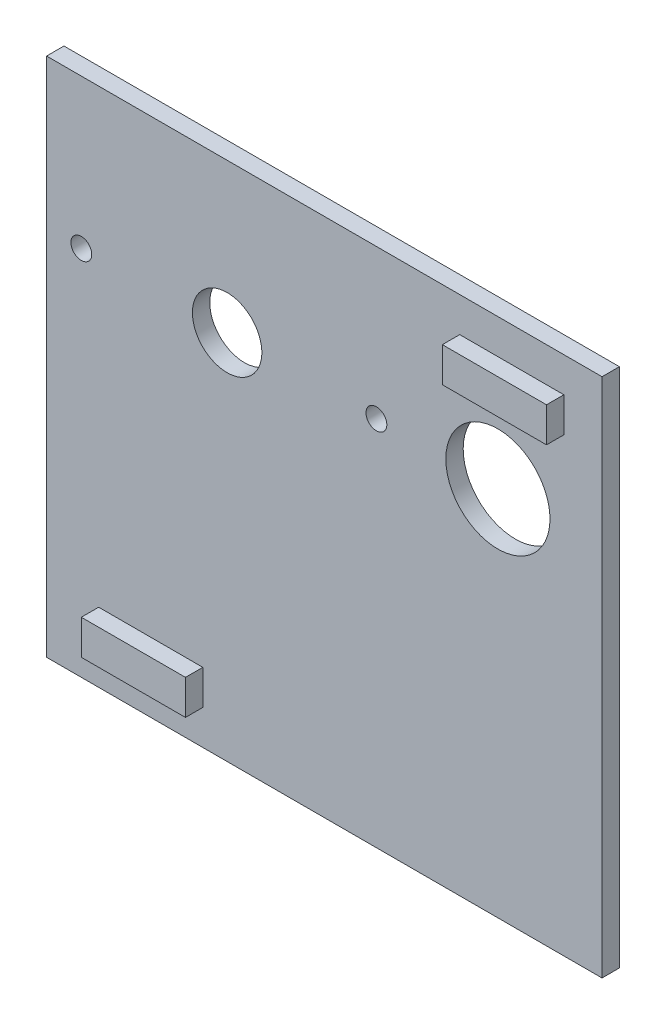
ISO-10303-21;
HEADER;
FILE_DESCRIPTION(('STEP AP214'),'2;1');
FILE_NAME('part.step','',(''),(''),'','','');
FILE_SCHEMA(('AUTOMOTIVE_DESIGN { 1 0 10303 214 1 1 1 1 }'));
ENDSEC;
DATA;
#1=APPLICATION_CONTEXT('core data for automotive mechanical design processes');
#2=APPLICATION_PROTOCOL_DEFINITION('international standard','automotive_design',2000,#1);
#3=PRODUCT_CONTEXT('',#1,'mechanical');
#4=PRODUCT('Part','Part','',(#3));
#5=PRODUCT_RELATED_PRODUCT_CATEGORY('part','',(#4));
#6=PRODUCT_DEFINITION_FORMATION('','',#4);
#7=PRODUCT_DEFINITION_CONTEXT('part definition',#1,'design');
#8=PRODUCT_DEFINITION('design','',#6,#7);
#9=PRODUCT_DEFINITION_SHAPE('','',#8);
#10=(LENGTH_UNIT() NAMED_UNIT(*) SI_UNIT(.MILLI.,.METRE.));
#11=(NAMED_UNIT(*) PLANE_ANGLE_UNIT() SI_UNIT($,.RADIAN.));
#12=(NAMED_UNIT(*) SI_UNIT($,.STERADIAN.) SOLID_ANGLE_UNIT());
#13=UNCERTAINTY_MEASURE_WITH_UNIT(LENGTH_MEASURE(1.E-05),#10,'distance_accuracy_value','');
#14=(GEOMETRIC_REPRESENTATION_CONTEXT(3) GLOBAL_UNCERTAINTY_ASSIGNED_CONTEXT((#13)) GLOBAL_UNIT_ASSIGNED_CONTEXT((#10,
#11,#12)) REPRESENTATION_CONTEXT('',''));
#15=CARTESIAN_POINT('',(0.,0.,0.));
#16=DIRECTION('',(0.,0.,1.));
#17=DIRECTION('',(1.,0.,0.));
#18=AXIS2_PLACEMENT_3D('',#15,#16,#17);
#19=CARTESIAN_POINT('',(0.,0.,5.));
#20=DIRECTION('',(0.,0.,-1.));
#21=DIRECTION('',(-1.,0.,0.));
#22=AXIS2_PLACEMENT_3D('',#19,#20,#21);
#23=PLANE('',#22);
#24=CARTESIAN_POINT('',(-150.,-43.,5.));
#25=DIRECTION('',(0.,0.,-1.));
#26=DIRECTION('',(-1.,0.,0.));
#27=AXIS2_PLACEMENT_3D('',#24,#25,#26);
#28=CIRCLE('',#27,2.99999999999999);
#29=CARTESIAN_POINT('',(-153.,-43.,5.));
#30=VERTEX_POINT('',#29);
#31=EDGE_CURVE('E230',#30,#30,#28,.T.);
#32=ORIENTED_EDGE('',*,*,#31,.T.);
#33=EDGE_LOOP('',(#32));
#34=FACE_BOUND('',#33,.T.);
#35=CARTESIAN_POINT('',(-108.,-43.,5.));
#36=DIRECTION('',(0.,0.,-1.));
#37=DIRECTION('',(-1.,0.,0.));
#38=AXIS2_PLACEMENT_3D('',#35,#36,#37);
#39=CIRCLE('',#38,9.99999999999999);
#40=CARTESIAN_POINT('',(-118.,-43.,5.));
#41=VERTEX_POINT('',#40);
#42=EDGE_CURVE('E219',#41,#41,#39,.T.);
#43=ORIENTED_EDGE('',*,*,#42,.T.);
#44=EDGE_LOOP('',(#43));
#45=FACE_BOUND('',#44,.T.);
#46=CARTESIAN_POINT('',(-65.,-43.,5.));
#47=DIRECTION('',(0.,0.,-1.));
#48=DIRECTION('',(-1.,0.,0.));
#49=AXIS2_PLACEMENT_3D('',#46,#47,#48);
#50=CIRCLE('',#49,3.00000000000001);
#51=CARTESIAN_POINT('',(-68.,-43.,5.));
#52=VERTEX_POINT('',#51);
#53=EDGE_CURVE('E216',#52,#52,#50,.T.);
#54=ORIENTED_EDGE('',*,*,#53,.T.);
#55=EDGE_LOOP('',(#54));
#56=FACE_BOUND('',#55,.T.);
#57=CARTESIAN_POINT('',(-30.,-43.,5.));
#58=DIRECTION('',(0.,0.,-1.));
#59=DIRECTION('',(-1.,0.,0.));
#60=AXIS2_PLACEMENT_3D('',#57,#58,#59);
#61=CIRCLE('',#60,15.);
#62=CARTESIAN_POINT('',(-45.,-43.,5.));
#63=VERTEX_POINT('',#62);
#64=EDGE_CURVE('E213',#63,#63,#61,.T.);
#65=ORIENTED_EDGE('',*,*,#64,.T.);
#66=EDGE_LOOP('',(#65));
#67=FACE_BOUND('',#66,.T.);
#68=DIRECTION('',(0.,-1.,0.));
#69=VECTOR('',#68,1.);
#70=CARTESIAN_POINT('',(-41.,-10.,5.));
#71=LINE('',#70,#69);
#72=CARTESIAN_POINT('',(-41.,-10.,5.));
#73=VERTEX_POINT('',#72);
#74=CARTESIAN_POINT('',(-41.,-20.,5.));
#75=VERTEX_POINT('',#74);
#76=EDGE_CURVE('E146',#73,#75,#71,.T.);
#77=ORIENTED_EDGE('',*,*,#76,.F.);
#78=DIRECTION('',(-1.,0.,0.));
#79=VECTOR('',#78,1.);
#80=CARTESIAN_POINT('',(-41.,-10.,5.));
#81=LINE('',#80,#79);
#82=CARTESIAN_POINT('',(-11.,-10.,5.));
#83=VERTEX_POINT('',#82);
#84=EDGE_CURVE('E159',#83,#73,#81,.T.);
#85=ORIENTED_EDGE('',*,*,#84,.F.);
#86=DIRECTION('',(0.,1.,0.));
#87=VECTOR('',#86,1.);
#88=CARTESIAN_POINT('',(-11.,-10.,5.));
#89=LINE('',#88,#87);
#90=CARTESIAN_POINT('',(-11.,-20.,5.));
#91=VERTEX_POINT('',#90);
#92=EDGE_CURVE('E168',#91,#83,#89,.T.);
#93=ORIENTED_EDGE('',*,*,#92,.F.);
#94=DIRECTION('',(1.,0.,0.));
#95=VECTOR('',#94,1.);
#96=CARTESIAN_POINT('',(-41.,-20.,5.));
#97=LINE('',#96,#95);
#98=EDGE_CURVE('E149',#75,#91,#97,.T.);
#99=ORIENTED_EDGE('',*,*,#98,.F.);
#100=EDGE_LOOP('',(#77,#85,#93,#99));
#101=FACE_BOUND('',#100,.T.);
#102=DIRECTION('',(0.,1.,0.));
#103=VECTOR('',#102,1.);
#104=CARTESIAN_POINT('',(0.,0.,5.));
#105=LINE('',#104,#103);
#106=CARTESIAN_POINT('',(0.,-150.,5.));
#107=VERTEX_POINT('',#106);
#108=CARTESIAN_POINT('',(0.,0.,5.));
#109=VERTEX_POINT('',#108);
#110=EDGE_CURVE('E185',#107,#109,#105,.T.);
#111=ORIENTED_EDGE('',*,*,#110,.T.);
#112=DIRECTION('',(-1.,0.,0.));
#113=VECTOR('',#112,1.);
#114=CARTESIAN_POINT('',(0.,0.,5.));
#115=LINE('',#114,#113);
#116=CARTESIAN_POINT('',(-160.,0.,5.));
#117=VERTEX_POINT('',#116);
#118=EDGE_CURVE('E188',#109,#117,#115,.T.);
#119=ORIENTED_EDGE('',*,*,#118,.T.);
#120=DIRECTION('',(0.,-1.,0.));
#121=VECTOR('',#120,1.);
#122=CARTESIAN_POINT('',(-160.,0.,5.));
#123=LINE('',#122,#121);
#124=CARTESIAN_POINT('',(-160.,-150.,5.));
#125=VERTEX_POINT('',#124);
#126=EDGE_CURVE('E191',#117,#125,#123,.T.);
#127=ORIENTED_EDGE('',*,*,#126,.T.);
#128=DIRECTION('',(1.,0.,0.));
#129=VECTOR('',#128,1.);
#130=CARTESIAN_POINT('',(0.,-150.,5.));
#131=LINE('',#130,#129);
#132=EDGE_CURVE('E193',#125,#107,#131,.T.);
#133=ORIENTED_EDGE('',*,*,#132,.T.);
#134=EDGE_LOOP('',(#111,#119,#127,#133));
#135=FACE_BOUND('',#134,.T.);
#136=DIRECTION('',(0.,-1.,0.));
#137=VECTOR('',#136,1.);
#138=CARTESIAN_POINT('',(-145.,-130.,5.));
#139=LINE('',#138,#137);
#140=CARTESIAN_POINT('',(-145.,-130.,5.));
#141=VERTEX_POINT('',#140);
#142=CARTESIAN_POINT('',(-145.,-140.,5.));
#143=VERTEX_POINT('',#142);
#144=EDGE_CURVE('E145',#141,#143,#139,.T.);
#145=ORIENTED_EDGE('',*,*,#144,.F.);
#146=DIRECTION('',(-1.,0.,0.));
#147=VECTOR('',#146,1.);
#148=CARTESIAN_POINT('',(-145.,-130.,5.));
#149=LINE('',#148,#147);
#150=CARTESIAN_POINT('',(-115.,-130.,5.));
#151=VERTEX_POINT('',#150);
#152=EDGE_CURVE('E142',#151,#141,#149,.T.);
#153=ORIENTED_EDGE('',*,*,#152,.F.);
#154=DIRECTION('',(0.,1.,0.));
#155=VECTOR('',#154,1.);
#156=CARTESIAN_POINT('',(-115.,-130.,5.));
#157=LINE('',#156,#155);
#158=CARTESIAN_POINT('',(-115.,-140.,5.));
#159=VERTEX_POINT('',#158);
#160=EDGE_CURVE('E56',#159,#151,#157,.T.);
#161=ORIENTED_EDGE('',*,*,#160,.F.);
#162=DIRECTION('',(1.,0.,0.));
#163=VECTOR('',#162,1.);
#164=CARTESIAN_POINT('',(-145.,-140.,5.));
#165=LINE('',#164,#163);
#166=EDGE_CURVE('E51',#143,#159,#165,.T.);
#167=ORIENTED_EDGE('',*,*,#166,.F.);
#168=EDGE_LOOP('',(#145,#153,#161,#167));
#169=FACE_BOUND('',#168,.T.);
#170=ADVANCED_FACE('F34',(#34,#45,#56,#67,#101,#135,#169),#23,.F.);
#171=CARTESIAN_POINT('',(0.,0.,5.));
#172=DIRECTION('',(-1.,0.,0.));
#173=DIRECTION('',(0.,-1.,0.));
#174=AXIS2_PLACEMENT_3D('',#171,#172,#173);
#175=PLANE('',#174);
#176=DIRECTION('',(0.,1.,0.));
#177=VECTOR('',#176,1.);
#178=CARTESIAN_POINT('',(0.,0.,0.));
#179=LINE('',#178,#177);
#180=CARTESIAN_POINT('',(0.,-150.,0.));
#181=VERTEX_POINT('',#180);
#182=CARTESIAN_POINT('',(0.,0.,0.));
#183=VERTEX_POINT('',#182);
#184=EDGE_CURVE('E184',#181,#183,#179,.T.);
#185=ORIENTED_EDGE('',*,*,#184,.T.);
#186=DIRECTION('',(0.,0.,-1.));
#187=VECTOR('',#186,1.);
#188=CARTESIAN_POINT('',(0.,0.,5.));
#189=LINE('',#188,#187);
#190=EDGE_CURVE('E11',#109,#183,#189,.T.);
#191=ORIENTED_EDGE('',*,*,#190,.F.);
#192=ORIENTED_EDGE('',*,*,#110,.F.);
#193=DIRECTION('',(0.,0.,-1.));
#194=VECTOR('',#193,1.);
#195=CARTESIAN_POINT('',(0.,-150.,5.));
#196=LINE('',#195,#194);
#197=EDGE_CURVE('E195',#107,#181,#196,.T.);
#198=ORIENTED_EDGE('',*,*,#197,.T.);
#199=EDGE_LOOP('',(#185,#191,#192,#198));
#200=FACE_BOUND('',#199,.T.);
#201=ADVANCED_FACE('F36',(#200),#175,.F.);
#202=CARTESIAN_POINT('',(0.,0.,5.));
#203=DIRECTION('',(0.,-1.,0.));
#204=DIRECTION('',(1.,0.,0.));
#205=AXIS2_PLACEMENT_3D('',#202,#203,#204);
#206=PLANE('',#205);
#207=DIRECTION('',(-1.,0.,0.));
#208=VECTOR('',#207,1.);
#209=CARTESIAN_POINT('',(0.,0.,0.));
#210=LINE('',#209,#208);
#211=CARTESIAN_POINT('',(-160.,0.,0.));
#212=VERTEX_POINT('',#211);
#213=EDGE_CURVE('E198',#183,#212,#210,.T.);
#214=ORIENTED_EDGE('',*,*,#213,.T.);
#215=DIRECTION('',(0.,0.,-1.));
#216=VECTOR('',#215,1.);
#217=CARTESIAN_POINT('',(-160.,0.,5.));
#218=LINE('',#217,#216);
#219=EDGE_CURVE('E43',#117,#212,#218,.T.);
#220=ORIENTED_EDGE('',*,*,#219,.F.);
#221=ORIENTED_EDGE('',*,*,#118,.F.);
#222=ORIENTED_EDGE('',*,*,#190,.T.);
#223=EDGE_LOOP('',(#214,#220,#221,#222));
#224=FACE_BOUND('',#223,.T.);
#225=ADVANCED_FACE('F261',(#224),#206,.F.);
#226=CARTESIAN_POINT('',(-160.,0.,5.));
#227=DIRECTION('',(1.,0.,0.));
#228=DIRECTION('',(0.,0.,-1.));
#229=AXIS2_PLACEMENT_3D('',#226,#227,#228);
#230=PLANE('',#229);
#231=DIRECTION('',(0.,-1.,0.));
#232=VECTOR('',#231,1.);
#233=CARTESIAN_POINT('',(-160.,0.,0.));
#234=LINE('',#233,#232);
#235=CARTESIAN_POINT('',(-160.,-150.,0.));
#236=VERTEX_POINT('',#235);
#237=EDGE_CURVE('E200',#212,#236,#234,.T.);
#238=ORIENTED_EDGE('',*,*,#237,.T.);
#239=DIRECTION('',(0.,0.,-1.));
#240=VECTOR('',#239,1.);
#241=CARTESIAN_POINT('',(-160.,-150.,5.));
#242=LINE('',#241,#240);
#243=EDGE_CURVE('E205',#125,#236,#242,.T.);
#244=ORIENTED_EDGE('',*,*,#243,.F.);
#245=ORIENTED_EDGE('',*,*,#126,.F.);
#246=ORIENTED_EDGE('',*,*,#219,.T.);
#247=EDGE_LOOP('',(#238,#244,#245,#246));
#248=FACE_BOUND('',#247,.T.);
#249=ADVANCED_FACE('F275',(#248),#230,.F.);
#250=CARTESIAN_POINT('',(0.,-150.,5.));
#251=DIRECTION('',(0.,1.,0.));
#252=DIRECTION('',(-1.,0.,0.));
#253=AXIS2_PLACEMENT_3D('',#250,#251,#252);
#254=PLANE('',#253);
#255=DIRECTION('',(1.,0.,0.));
#256=VECTOR('',#255,1.);
#257=CARTESIAN_POINT('',(0.,-150.,0.));
#258=LINE('',#257,#256);
#259=EDGE_CURVE('E189',#236,#181,#258,.T.);
#260=ORIENTED_EDGE('',*,*,#259,.T.);
#261=ORIENTED_EDGE('',*,*,#197,.F.);
#262=ORIENTED_EDGE('',*,*,#132,.F.);
#263=ORIENTED_EDGE('',*,*,#243,.T.);
#264=EDGE_LOOP('',(#260,#261,#262,#263));
#265=FACE_BOUND('',#264,.T.);
#266=ADVANCED_FACE('F271',(#265),#254,.F.);
#267=CARTESIAN_POINT('',(0.,0.,0.));
#268=DIRECTION('',(0.,0.,-1.));
#269=DIRECTION('',(-1.,0.,0.));
#270=AXIS2_PLACEMENT_3D('',#267,#268,#269);
#271=PLANE('',#270);
#272=CARTESIAN_POINT('',(-150.,-43.,0.));
#273=DIRECTION('',(0.,0.,-1.));
#274=DIRECTION('',(-1.,0.,0.));
#275=AXIS2_PLACEMENT_3D('',#272,#273,#274);
#276=CIRCLE('',#275,2.99999999999999);
#277=CARTESIAN_POINT('',(-153.,-43.,0.));
#278=VERTEX_POINT('',#277);
#279=EDGE_CURVE('E38',#278,#278,#276,.T.);
#280=ORIENTED_EDGE('',*,*,#279,.F.);
#281=EDGE_LOOP('',(#280));
#282=FACE_BOUND('',#281,.T.);
#283=CARTESIAN_POINT('',(-108.,-43.,0.));
#284=DIRECTION('',(0.,0.,-1.));
#285=DIRECTION('',(-1.,0.,0.));
#286=AXIS2_PLACEMENT_3D('',#283,#284,#285);
#287=CIRCLE('',#286,9.99999999999999);
#288=CARTESIAN_POINT('',(-118.,-43.,0.));
#289=VERTEX_POINT('',#288);
#290=EDGE_CURVE('E217',#289,#289,#287,.T.);
#291=ORIENTED_EDGE('',*,*,#290,.F.);
#292=EDGE_LOOP('',(#291));
#293=FACE_BOUND('',#292,.T.);
#294=CARTESIAN_POINT('',(-65.,-43.,0.));
#295=DIRECTION('',(0.,0.,-1.));
#296=DIRECTION('',(-1.,0.,0.));
#297=AXIS2_PLACEMENT_3D('',#294,#295,#296);
#298=CIRCLE('',#297,3.00000000000001);
#299=CARTESIAN_POINT('',(-68.,-43.,0.));
#300=VERTEX_POINT('',#299);
#301=EDGE_CURVE('E214',#300,#300,#298,.T.);
#302=ORIENTED_EDGE('',*,*,#301,.F.);
#303=EDGE_LOOP('',(#302));
#304=FACE_BOUND('',#303,.T.);
#305=CARTESIAN_POINT('',(-30.,-43.,0.));
#306=DIRECTION('',(0.,0.,-1.));
#307=DIRECTION('',(-1.,0.,0.));
#308=AXIS2_PLACEMENT_3D('',#305,#306,#307);
#309=CIRCLE('',#308,15.);
#310=CARTESIAN_POINT('',(-45.,-43.,0.));
#311=VERTEX_POINT('',#310);
#312=EDGE_CURVE('E210',#311,#311,#309,.T.);
#313=ORIENTED_EDGE('',*,*,#312,.F.);
#314=EDGE_LOOP('',(#313));
#315=FACE_BOUND('',#314,.T.);
#316=ORIENTED_EDGE('',*,*,#184,.F.);
#317=ORIENTED_EDGE('',*,*,#259,.F.);
#318=ORIENTED_EDGE('',*,*,#237,.F.);
#319=ORIENTED_EDGE('',*,*,#213,.F.);
#320=EDGE_LOOP('',(#316,#317,#318,#319));
#321=FACE_BOUND('',#320,.T.);
#322=ADVANCED_FACE('F268',(#282,#293,#304,#315,#321),#271,.T.);
#323=CARTESIAN_POINT('',(-41.,-10.,10.));
#324=DIRECTION('',(1.,0.,0.));
#325=DIRECTION('',(0.,1.,0.));
#326=AXIS2_PLACEMENT_3D('',#323,#324,#325);
#327=PLANE('',#326);
#328=ORIENTED_EDGE('',*,*,#76,.T.);
#329=DIRECTION('',(0.,0.,-1.));
#330=VECTOR('',#329,1.);
#331=CARTESIAN_POINT('',(-41.,-20.,10.));
#332=LINE('',#331,#330);
#333=CARTESIAN_POINT('',(-41.,-20.,10.));
#334=VERTEX_POINT('',#333);
#335=EDGE_CURVE('E181',#334,#75,#332,.T.);
#336=ORIENTED_EDGE('',*,*,#335,.F.);
#337=DIRECTION('',(0.,-1.,0.));
#338=VECTOR('',#337,1.);
#339=CARTESIAN_POINT('',(-41.,-10.,10.));
#340=LINE('',#339,#338);
#341=CARTESIAN_POINT('',(-41.,-10.,10.));
#342=VERTEX_POINT('',#341);
#343=EDGE_CURVE('E155',#342,#334,#340,.T.);
#344=ORIENTED_EDGE('',*,*,#343,.F.);
#345=DIRECTION('',(0.,0.,-1.));
#346=VECTOR('',#345,1.);
#347=CARTESIAN_POINT('',(-41.,-10.,10.));
#348=LINE('',#347,#346);
#349=EDGE_CURVE('E164',#342,#73,#348,.T.);
#350=ORIENTED_EDGE('',*,*,#349,.T.);
#351=EDGE_LOOP('',(#328,#336,#344,#350));
#352=FACE_BOUND('',#351,.T.);
#353=ADVANCED_FACE('F266',(#352),#327,.F.);
#354=CARTESIAN_POINT('',(-41.,-20.,10.));
#355=DIRECTION('',(0.,1.,0.));
#356=DIRECTION('',(-1.,0.,0.));
#357=AXIS2_PLACEMENT_3D('',#354,#355,#356);
#358=PLANE('',#357);
#359=ORIENTED_EDGE('',*,*,#98,.T.);
#360=DIRECTION('',(0.,0.,-1.));
#361=VECTOR('',#360,1.);
#362=CARTESIAN_POINT('',(-11.,-20.,10.));
#363=LINE('',#362,#361);
#364=CARTESIAN_POINT('',(-11.,-20.,10.));
#365=VERTEX_POINT('',#364);
#366=EDGE_CURVE('E178',#365,#91,#363,.T.);
#367=ORIENTED_EDGE('',*,*,#366,.F.);
#368=DIRECTION('',(1.,0.,0.));
#369=VECTOR('',#368,1.);
#370=CARTESIAN_POINT('',(-41.,-20.,10.));
#371=LINE('',#370,#369);
#372=EDGE_CURVE('E158',#334,#365,#371,.T.);
#373=ORIENTED_EDGE('',*,*,#372,.F.);
#374=ORIENTED_EDGE('',*,*,#335,.T.);
#375=EDGE_LOOP('',(#359,#367,#373,#374));
#376=FACE_BOUND('',#375,.T.);
#377=ADVANCED_FACE('F316',(#376),#358,.F.);
#378=CARTESIAN_POINT('',(-11.,-10.,10.));
#379=DIRECTION('',(-1.,0.,0.));
#380=DIRECTION('',(0.,-1.,0.));
#381=AXIS2_PLACEMENT_3D('',#378,#379,#380);
#382=PLANE('',#381);
#383=ORIENTED_EDGE('',*,*,#92,.T.);
#384=DIRECTION('',(0.,0.,-1.));
#385=VECTOR('',#384,1.);
#386=CARTESIAN_POINT('',(-11.,-10.,10.));
#387=LINE('',#386,#385);
#388=CARTESIAN_POINT('',(-11.,-10.,10.));
#389=VERTEX_POINT('',#388);
#390=EDGE_CURVE('E175',#389,#83,#387,.T.);
#391=ORIENTED_EDGE('',*,*,#390,.F.);
#392=DIRECTION('',(0.,1.,0.));
#393=VECTOR('',#392,1.);
#394=CARTESIAN_POINT('',(-11.,-10.,10.));
#395=LINE('',#394,#393);
#396=EDGE_CURVE('E161',#365,#389,#395,.T.);
#397=ORIENTED_EDGE('',*,*,#396,.F.);
#398=ORIENTED_EDGE('',*,*,#366,.T.);
#399=EDGE_LOOP('',(#383,#391,#397,#398));
#400=FACE_BOUND('',#399,.T.);
#401=ADVANCED_FACE('F323',(#400),#382,.F.);
#402=CARTESIAN_POINT('',(-41.,-10.,10.));
#403=DIRECTION('',(0.,-1.,0.));
#404=DIRECTION('',(1.,0.,0.));
#405=AXIS2_PLACEMENT_3D('',#402,#403,#404);
#406=PLANE('',#405);
#407=ORIENTED_EDGE('',*,*,#84,.T.);
#408=ORIENTED_EDGE('',*,*,#349,.F.);
#409=DIRECTION('',(-1.,0.,0.));
#410=VECTOR('',#409,1.);
#411=CARTESIAN_POINT('',(-41.,-10.,10.));
#412=LINE('',#411,#410);
#413=EDGE_CURVE('E163',#389,#342,#412,.T.);
#414=ORIENTED_EDGE('',*,*,#413,.F.);
#415=ORIENTED_EDGE('',*,*,#390,.T.);
#416=EDGE_LOOP('',(#407,#408,#414,#415));
#417=FACE_BOUND('',#416,.T.);
#418=ADVANCED_FACE('F330',(#417),#406,.F.);
#419=CARTESIAN_POINT('',(0.,0.,10.));
#420=DIRECTION('',(0.,0.,1.));
#421=DIRECTION('',(1.,0.,0.));
#422=AXIS2_PLACEMENT_3D('',#419,#420,#421);
#423=PLANE('',#422);
#424=ORIENTED_EDGE('',*,*,#343,.T.);
#425=ORIENTED_EDGE('',*,*,#372,.T.);
#426=ORIENTED_EDGE('',*,*,#396,.T.);
#427=ORIENTED_EDGE('',*,*,#413,.T.);
#428=EDGE_LOOP('',(#424,#425,#426,#427));
#429=FACE_BOUND('',#428,.T.);
#430=ADVANCED_FACE('F338',(#429),#423,.T.);
#431=CARTESIAN_POINT('',(-145.,-130.,10.));
#432=DIRECTION('',(1.,0.,0.));
#433=DIRECTION('',(0.,0.,-1.));
#434=AXIS2_PLACEMENT_3D('',#431,#432,#433);
#435=PLANE('',#434);
#436=ORIENTED_EDGE('',*,*,#144,.T.);
#437=DIRECTION('',(0.,0.,-1.));
#438=VECTOR('',#437,1.);
#439=CARTESIAN_POINT('',(-145.,-140.,10.));
#440=LINE('',#439,#438);
#441=CARTESIAN_POINT('',(-145.,-140.,10.));
#442=VERTEX_POINT('',#441);
#443=EDGE_CURVE('E126',#442,#143,#440,.T.);
#444=ORIENTED_EDGE('',*,*,#443,.F.);
#445=DIRECTION('',(0.,-1.,0.));
#446=VECTOR('',#445,1.);
#447=CARTESIAN_POINT('',(-145.,-130.,10.));
#448=LINE('',#447,#446);
#449=CARTESIAN_POINT('',(-145.,-130.,10.));
#450=VERTEX_POINT('',#449);
#451=EDGE_CURVE('E133',#450,#442,#448,.T.);
#452=ORIENTED_EDGE('',*,*,#451,.F.);
#453=DIRECTION('',(0.,0.,-1.));
#454=VECTOR('',#453,1.);
#455=CARTESIAN_POINT('',(-145.,-130.,10.));
#456=LINE('',#455,#454);
#457=EDGE_CURVE('E235',#450,#141,#456,.T.);
#458=ORIENTED_EDGE('',*,*,#457,.T.);
#459=EDGE_LOOP('',(#436,#444,#452,#458));
#460=FACE_BOUND('',#459,.T.);
#461=ADVANCED_FACE('F144',(#460),#435,.F.);
#462=CARTESIAN_POINT('',(-145.,-140.,10.));
#463=DIRECTION('',(0.,1.,0.));
#464=DIRECTION('',(0.,0.,1.));
#465=AXIS2_PLACEMENT_3D('',#462,#463,#464);
#466=PLANE('',#465);
#467=ORIENTED_EDGE('',*,*,#166,.T.);
#468=DIRECTION('',(0.,0.,-1.));
#469=VECTOR('',#468,1.);
#470=CARTESIAN_POINT('',(-115.,-140.,10.));
#471=LINE('',#470,#469);
#472=CARTESIAN_POINT('',(-115.,-140.,10.));
#473=VERTEX_POINT('',#472);
#474=EDGE_CURVE('E129',#473,#159,#471,.T.);
#475=ORIENTED_EDGE('',*,*,#474,.F.);
#476=DIRECTION('',(1.,0.,0.));
#477=VECTOR('',#476,1.);
#478=CARTESIAN_POINT('',(-145.,-140.,10.));
#479=LINE('',#478,#477);
#480=EDGE_CURVE('E122',#442,#473,#479,.T.);
#481=ORIENTED_EDGE('',*,*,#480,.F.);
#482=ORIENTED_EDGE('',*,*,#443,.T.);
#483=EDGE_LOOP('',(#467,#475,#481,#482));
#484=FACE_BOUND('',#483,.T.);
#485=ADVANCED_FACE('F124',(#484),#466,.F.);
#486=CARTESIAN_POINT('',(-115.,-130.,10.));
#487=DIRECTION('',(-1.,0.,0.));
#488=DIRECTION('',(0.,0.,1.));
#489=AXIS2_PLACEMENT_3D('',#486,#487,#488);
#490=PLANE('',#489);
#491=ORIENTED_EDGE('',*,*,#160,.T.);
#492=DIRECTION('',(0.,0.,-1.));
#493=VECTOR('',#492,1.);
#494=CARTESIAN_POINT('',(-115.,-130.,10.));
#495=LINE('',#494,#493);
#496=CARTESIAN_POINT('',(-115.,-130.,10.));
#497=VERTEX_POINT('',#496);
#498=EDGE_CURVE('E151',#497,#151,#495,.T.);
#499=ORIENTED_EDGE('',*,*,#498,.F.);
#500=DIRECTION('',(0.,1.,0.));
#501=VECTOR('',#500,1.);
#502=CARTESIAN_POINT('',(-115.,-130.,10.));
#503=LINE('',#502,#501);
#504=EDGE_CURVE('E132',#473,#497,#503,.T.);
#505=ORIENTED_EDGE('',*,*,#504,.F.);
#506=ORIENTED_EDGE('',*,*,#474,.T.);
#507=EDGE_LOOP('',(#491,#499,#505,#506));
#508=FACE_BOUND('',#507,.T.);
#509=ADVANCED_FACE('F246',(#508),#490,.F.);
#510=CARTESIAN_POINT('',(-145.,-130.,10.));
#511=DIRECTION('',(0.,-1.,0.));
#512=DIRECTION('',(1.,0.,0.));
#513=AXIS2_PLACEMENT_3D('',#510,#511,#512);
#514=PLANE('',#513);
#515=ORIENTED_EDGE('',*,*,#152,.T.);
#516=ORIENTED_EDGE('',*,*,#457,.F.);
#517=DIRECTION('',(-1.,0.,0.));
#518=VECTOR('',#517,1.);
#519=CARTESIAN_POINT('',(-145.,-130.,10.));
#520=LINE('',#519,#518);
#521=EDGE_CURVE('E138',#497,#450,#520,.T.);
#522=ORIENTED_EDGE('',*,*,#521,.F.);
#523=ORIENTED_EDGE('',*,*,#498,.T.);
#524=EDGE_LOOP('',(#515,#516,#522,#523));
#525=FACE_BOUND('',#524,.T.);
#526=ADVANCED_FACE('F244',(#525),#514,.F.);
#527=CARTESIAN_POINT('',(0.,0.,10.));
#528=DIRECTION('',(0.,0.,1.));
#529=DIRECTION('',(1.,0.,0.));
#530=AXIS2_PLACEMENT_3D('',#527,#528,#529);
#531=PLANE('',#530);
#532=ORIENTED_EDGE('',*,*,#451,.T.);
#533=ORIENTED_EDGE('',*,*,#480,.T.);
#534=ORIENTED_EDGE('',*,*,#504,.T.);
#535=ORIENTED_EDGE('',*,*,#521,.T.);
#536=EDGE_LOOP('',(#532,#533,#534,#535));
#537=FACE_BOUND('',#536,.T.);
#538=ADVANCED_FACE('F136',(#537),#531,.T.);
#539=CARTESIAN_POINT('',(-30.,-43.,-5.));
#540=DIRECTION('',(0.,0.,1.));
#541=DIRECTION('',(1.,0.,0.));
#542=AXIS2_PLACEMENT_3D('',#539,#540,#541);
#543=CYLINDRICAL_SURFACE('',#542,15.);
#544=ORIENTED_EDGE('',*,*,#312,.T.);
#545=EDGE_LOOP('',(#544));
#546=FACE_BOUND('',#545,.T.);
#547=ORIENTED_EDGE('',*,*,#64,.F.);
#548=EDGE_LOOP('',(#547));
#549=FACE_BOUND('',#548,.T.);
#550=ADVANCED_FACE('F375',(#546,#549),#543,.F.);
#551=CARTESIAN_POINT('',(-65.,-43.,-5.));
#552=DIRECTION('',(0.,0.,1.));
#553=DIRECTION('',(1.,0.,0.));
#554=AXIS2_PLACEMENT_3D('',#551,#552,#553);
#555=CYLINDRICAL_SURFACE('',#554,3.00000000000001);
#556=ORIENTED_EDGE('',*,*,#301,.T.);
#557=EDGE_LOOP('',(#556));
#558=FACE_BOUND('',#557,.T.);
#559=ORIENTED_EDGE('',*,*,#53,.F.);
#560=EDGE_LOOP('',(#559));
#561=FACE_BOUND('',#560,.T.);
#562=ADVANCED_FACE('F412',(#558,#561),#555,.F.);
#563=CARTESIAN_POINT('',(-108.,-43.,-5.));
#564=DIRECTION('',(0.,0.,1.));
#565=DIRECTION('',(1.,0.,0.));
#566=AXIS2_PLACEMENT_3D('',#563,#564,#565);
#567=CYLINDRICAL_SURFACE('',#566,9.99999999999999);
#568=ORIENTED_EDGE('',*,*,#290,.T.);
#569=EDGE_LOOP('',(#568));
#570=FACE_BOUND('',#569,.T.);
#571=ORIENTED_EDGE('',*,*,#42,.F.);
#572=EDGE_LOOP('',(#571));
#573=FACE_BOUND('',#572,.T.);
#574=ADVANCED_FACE('F419',(#570,#573),#567,.F.);
#575=CARTESIAN_POINT('',(-150.,-43.,-5.));
#576=DIRECTION('',(0.,0.,1.));
#577=DIRECTION('',(1.,0.,0.));
#578=AXIS2_PLACEMENT_3D('',#575,#576,#577);
#579=CYLINDRICAL_SURFACE('',#578,2.99999999999999);
#580=ORIENTED_EDGE('',*,*,#279,.T.);
#581=EDGE_LOOP('',(#580));
#582=FACE_BOUND('',#581,.T.);
#583=ORIENTED_EDGE('',*,*,#31,.F.);
#584=EDGE_LOOP('',(#583));
#585=FACE_BOUND('',#584,.T.);
#586=ADVANCED_FACE('F427',(#582,#585),#579,.F.);
#587=CLOSED_SHELL('',(#170,#201,#225,#249,#266,#322,#353,#377,#401,#418,#430,#461,#485,#509,
#526,#538,#550,#562,#574,#586));
#588=MANIFOLD_SOLID_BREP('B2',#587);
#589=ADVANCED_BREP_SHAPE_REPRESENTATION('',(#18,#588),#14);
#590=SHAPE_DEFINITION_REPRESENTATION(#9,#589);
ENDSEC;
END-ISO-10303-21;
